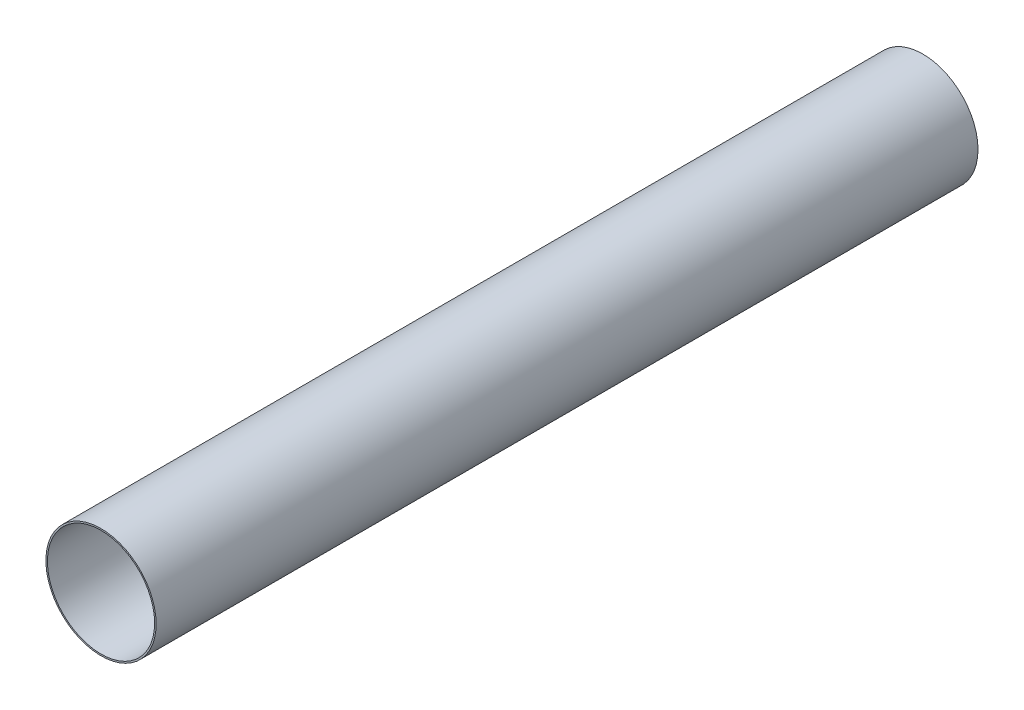
ISO-10303-21;
HEADER;
FILE_DESCRIPTION(('STEP AP214'),'2;1');
FILE_NAME('part.step','',(''),(''),'','','');
FILE_SCHEMA(('AUTOMOTIVE_DESIGN { 1 0 10303 214 1 1 1 1 }'));
ENDSEC;
DATA;
#1=APPLICATION_CONTEXT('core data for automotive mechanical design processes');
#2=APPLICATION_PROTOCOL_DEFINITION('international standard','automotive_design',2000,#1);
#3=PRODUCT_CONTEXT('',#1,'mechanical');
#4=PRODUCT('Part','Part','',(#3));
#5=PRODUCT_RELATED_PRODUCT_CATEGORY('part','',(#4));
#6=PRODUCT_DEFINITION_FORMATION('','',#4);
#7=PRODUCT_DEFINITION_CONTEXT('part definition',#1,'design');
#8=PRODUCT_DEFINITION('design','',#6,#7);
#9=PRODUCT_DEFINITION_SHAPE('','',#8);
#10=(LENGTH_UNIT() NAMED_UNIT(*) SI_UNIT(.MILLI.,.METRE.));
#11=(NAMED_UNIT(*) PLANE_ANGLE_UNIT() SI_UNIT($,.RADIAN.));
#12=(NAMED_UNIT(*) SI_UNIT($,.STERADIAN.) SOLID_ANGLE_UNIT());
#13=UNCERTAINTY_MEASURE_WITH_UNIT(LENGTH_MEASURE(1.E-05),#10,'distance_accuracy_value','');
#14=(GEOMETRIC_REPRESENTATION_CONTEXT(3) GLOBAL_UNCERTAINTY_ASSIGNED_CONTEXT((#13)) GLOBAL_UNIT_ASSIGNED_CONTEXT((#10,
#11,#12)) REPRESENTATION_CONTEXT('',''));
#15=CARTESIAN_POINT('',(0.,0.,0.));
#16=DIRECTION('',(0.,0.,1.));
#17=DIRECTION('',(1.,0.,0.));
#18=AXIS2_PLACEMENT_3D('',#15,#16,#17);
#19=CARTESIAN_POINT('',(0.,0.,1168.4));
#20=DIRECTION('',(0.,0.,1.));
#21=DIRECTION('',(1.,0.,0.));
#22=AXIS2_PLACEMENT_3D('',#19,#20,#21);
#23=PLANE('',#22);
#24=CARTESIAN_POINT('',(0.,0.,1168.4));
#25=DIRECTION('',(0.,0.,1.));
#26=DIRECTION('',(1.,0.,0.));
#27=AXIS2_PLACEMENT_3D('',#24,#25,#26);
#28=CIRCLE('',#27,78.359);
#29=CARTESIAN_POINT('',(78.359,0.,1168.4));
#30=VERTEX_POINT('',#29);
#31=EDGE_CURVE('E10',#30,#30,#28,.T.);
#32=ORIENTED_EDGE('',*,*,#31,.T.);
#33=EDGE_LOOP('',(#32));
#34=FACE_BOUND('',#33,.T.);
#35=CARTESIAN_POINT('',(0.,0.,1168.4));
#36=DIRECTION('',(0.,0.,1.));
#37=DIRECTION('',(1.,0.,0.));
#38=AXIS2_PLACEMENT_3D('',#35,#36,#37);
#39=CIRCLE('',#38,76.2);
#40=CARTESIAN_POINT('',(76.2,0.,1168.4));
#41=VERTEX_POINT('',#40);
#42=EDGE_CURVE('E50',#41,#41,#39,.T.);
#43=ORIENTED_EDGE('',*,*,#42,.F.);
#44=EDGE_LOOP('',(#43));
#45=FACE_BOUND('',#44,.T.);
#46=ADVANCED_FACE('F37',(#34,#45),#23,.T.);
#47=CARTESIAN_POINT('',(0.,0.,0.));
#48=DIRECTION('',(0.,0.,1.));
#49=DIRECTION('',(1.,0.,0.));
#50=AXIS2_PLACEMENT_3D('',#47,#48,#49);
#51=PLANE('',#50);
#52=CARTESIAN_POINT('',(0.,0.,0.));
#53=DIRECTION('',(0.,0.,1.));
#54=DIRECTION('',(1.,0.,0.));
#55=AXIS2_PLACEMENT_3D('',#52,#53,#54);
#56=CIRCLE('',#55,78.359);
#57=CARTESIAN_POINT('',(78.359,0.,0.));
#58=VERTEX_POINT('',#57);
#59=EDGE_CURVE('E41',#58,#58,#56,.T.);
#60=ORIENTED_EDGE('',*,*,#59,.F.);
#61=EDGE_LOOP('',(#60));
#62=FACE_BOUND('',#61,.T.);
#63=CARTESIAN_POINT('',(0.,0.,0.));
#64=DIRECTION('',(0.,0.,1.));
#65=DIRECTION('',(1.,0.,0.));
#66=AXIS2_PLACEMENT_3D('',#63,#64,#65);
#67=CIRCLE('',#66,76.2);
#68=CARTESIAN_POINT('',(76.2,0.,0.));
#69=VERTEX_POINT('',#68);
#70=EDGE_CURVE('E52',#69,#69,#67,.T.);
#71=ORIENTED_EDGE('',*,*,#70,.T.);
#72=EDGE_LOOP('',(#71));
#73=FACE_BOUND('',#72,.T.);
#74=ADVANCED_FACE('F64',(#62,#73),#51,.F.);
#75=CARTESIAN_POINT('',(0.,0.,1168.4));
#76=DIRECTION('',(0.,0.,-1.));
#77=DIRECTION('',(-1.,0.,0.));
#78=AXIS2_PLACEMENT_3D('',#75,#76,#77);
#79=CYLINDRICAL_SURFACE('',#78,78.359);
#80=ORIENTED_EDGE('',*,*,#31,.F.);
#81=EDGE_LOOP('',(#80));
#82=FACE_BOUND('',#81,.T.);
#83=ORIENTED_EDGE('',*,*,#59,.T.);
#84=EDGE_LOOP('',(#83));
#85=FACE_BOUND('',#84,.T.);
#86=ADVANCED_FACE('F39',(#82,#85),#79,.T.);
#87=CARTESIAN_POINT('',(0.,0.,1168.4));
#88=DIRECTION('',(0.,0.,-1.));
#89=DIRECTION('',(-1.,0.,0.));
#90=AXIS2_PLACEMENT_3D('',#87,#88,#89);
#91=CYLINDRICAL_SURFACE('',#90,76.2);
#92=ORIENTED_EDGE('',*,*,#42,.T.);
#93=EDGE_LOOP('',(#92));
#94=FACE_BOUND('',#93,.T.);
#95=ORIENTED_EDGE('',*,*,#70,.F.);
#96=EDGE_LOOP('',(#95));
#97=FACE_BOUND('',#96,.T.);
#98=ADVANCED_FACE('F60',(#94,#97),#91,.F.);
#99=CLOSED_SHELL('',(#46,#74,#86,#98));
#100=MANIFOLD_SOLID_BREP('B2',#99);
#101=ADVANCED_BREP_SHAPE_REPRESENTATION('',(#18,#100),#14);
#102=SHAPE_DEFINITION_REPRESENTATION(#9,#101);
ENDSEC;
END-ISO-10303-21;
